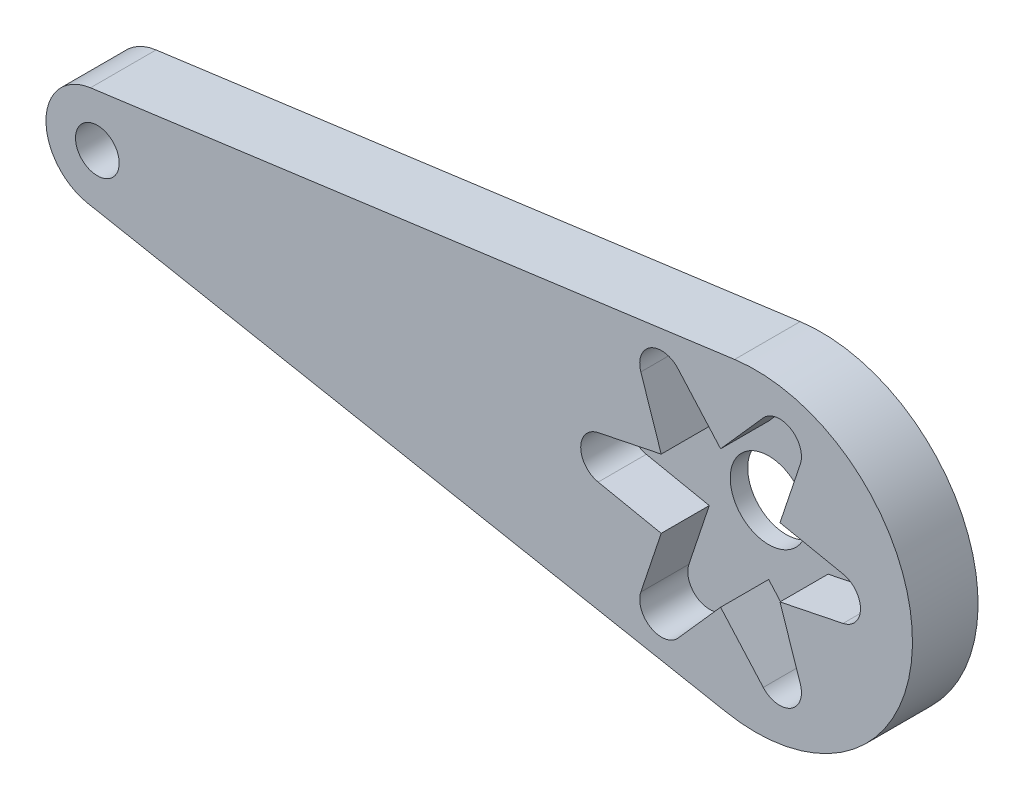
ISO-10303-21;
HEADER;
FILE_DESCRIPTION(('STEP AP214'),'2;1');
FILE_NAME('part.step','',(''),(''),'','','');
FILE_SCHEMA(('AUTOMOTIVE_DESIGN { 1 0 10303 214 1 1 1 1 }'));
ENDSEC;
DATA;
#1=APPLICATION_CONTEXT('core data for automotive mechanical design processes');
#2=APPLICATION_PROTOCOL_DEFINITION('international standard','automotive_design',2000,#1);
#3=PRODUCT_CONTEXT('',#1,'mechanical');
#4=PRODUCT('Part','Part','',(#3));
#5=PRODUCT_RELATED_PRODUCT_CATEGORY('part','',(#4));
#6=PRODUCT_DEFINITION_FORMATION('','',#4);
#7=PRODUCT_DEFINITION_CONTEXT('part definition',#1,'design');
#8=PRODUCT_DEFINITION('design','',#6,#7);
#9=PRODUCT_DEFINITION_SHAPE('','',#8);
#10=(LENGTH_UNIT() NAMED_UNIT(*) SI_UNIT(.MILLI.,.METRE.));
#11=(NAMED_UNIT(*) PLANE_ANGLE_UNIT() SI_UNIT($,.RADIAN.));
#12=(NAMED_UNIT(*) SI_UNIT($,.STERADIAN.) SOLID_ANGLE_UNIT());
#13=UNCERTAINTY_MEASURE_WITH_UNIT(LENGTH_MEASURE(1.E-05),#10,'distance_accuracy_value','');
#14=(GEOMETRIC_REPRESENTATION_CONTEXT(3) GLOBAL_UNCERTAINTY_ASSIGNED_CONTEXT((#13)) GLOBAL_UNIT_ASSIGNED_CONTEXT((#10,
#11,#12)) REPRESENTATION_CONTEXT('',''));
#15=CARTESIAN_POINT('',(0.,0.,0.));
#16=DIRECTION('',(0.,0.,1.));
#17=DIRECTION('',(1.,0.,0.));
#18=AXIS2_PLACEMENT_3D('',#15,#16,#17);
#19=CARTESIAN_POINT('',(5.87542804583031,-35.7470503145762,0.));
#20=DIRECTION('',(0.,0.,-1.));
#21=DIRECTION('',(-1.,0.,0.));
#22=AXIS2_PLACEMENT_3D('',#19,#20,#21);
#23=CYLINDRICAL_SURFACE('',#22,5.87542804583031);
#24=DIRECTION('',(0.,0.,-1.));
#25=VECTOR('',#24,1.);
#26=CARTESIAN_POINT('',(5.0907369305427,-29.9242576362029,7.5));
#27=LINE('',#26,#25);
#28=CARTESIAN_POINT('',(5.09073693054267,-29.9242576362029,0.));
#29=VERTEX_POINT('',#28);
#30=CARTESIAN_POINT('',(5.09073693054267,-29.9242576362029,7.5));
#31=VERTEX_POINT('',#30);
#32=EDGE_CURVE('E369',#29,#31,#27,.F.);
#33=ORIENTED_EDGE('',*,*,#32,.F.);
#34=CARTESIAN_POINT('',(5.87542804583031,-35.7470503145762,0.));
#35=DIRECTION('',(0.,0.,1.));
#36=DIRECTION('',(1.,0.,0.));
#37=AXIS2_PLACEMENT_3D('',#34,#35,#36);
#38=CIRCLE('',#37,5.87542804583031);
#39=CARTESIAN_POINT('',(4.77759431673095,-41.5190010961561,0.));
#40=VERTEX_POINT('',#39);
#41=EDGE_CURVE('E56',#40,#29,#38,.F.);
#42=ORIENTED_EDGE('',*,*,#41,.F.);
#43=DIRECTION('',(0.,0.,-1.));
#44=VECTOR('',#43,1.);
#45=CARTESIAN_POINT('',(4.77759431673095,-41.5190010961561,7.5));
#46=LINE('',#45,#44);
#47=CARTESIAN_POINT('',(4.77759431673095,-41.5190010961561,7.5));
#48=VERTEX_POINT('',#47);
#49=EDGE_CURVE('E372',#48,#40,#46,.T.);
#50=ORIENTED_EDGE('',*,*,#49,.F.);
#51=CARTESIAN_POINT('',(5.87542804583031,-35.7470503145762,7.5));
#52=DIRECTION('',(0.,0.,1.));
#53=DIRECTION('',(1.,0.,0.));
#54=AXIS2_PLACEMENT_3D('',#51,#52,#53);
#55=CIRCLE('',#54,5.87542804583031);
#56=EDGE_CURVE('E12',#31,#48,#55,.T.);
#57=ORIENTED_EDGE('',*,*,#56,.F.);
#58=EDGE_LOOP('',(#33,#42,#50,#57));
#59=FACE_BOUND('',#58,.T.);
#60=ADVANCED_FACE('F47',(#59),#23,.T.);
#61=CARTESIAN_POINT('',(81.1592148988789,-37.7802614739461,7.5));
#62=DIRECTION('',(0.,0.,-1.));
#63=DIRECTION('',(-1.,0.,0.));
#64=AXIS2_PLACEMENT_3D('',#61,#62,#63);
#65=CYLINDRICAL_SURFACE('',#64,17.9449292239593);
#66=DIRECTION('',(0.,0.,-1.));
#67=VECTOR('',#66,1.);
#68=CARTESIAN_POINT('',(78.7625849994626,-19.9960929530922,7.5));
#69=LINE('',#68,#67);
#70=CARTESIAN_POINT('',(78.7625849994626,-19.9960929530922,7.5));
#71=VERTEX_POINT('',#70);
#72=CARTESIAN_POINT('',(78.7625849994626,-19.9960929530922,0.));
#73=VERTEX_POINT('',#72);
#74=EDGE_CURVE('E355',#71,#73,#69,.T.);
#75=ORIENTED_EDGE('',*,*,#74,.F.);
#76=CARTESIAN_POINT('',(81.1592148988789,-37.7802614739461,7.5));
#77=DIRECTION('',(0.,0.,1.));
#78=DIRECTION('',(1.,0.,0.));
#79=AXIS2_PLACEMENT_3D('',#76,#77,#78);
#80=CIRCLE('',#79,17.9449292239593);
#81=CARTESIAN_POINT('',(77.8061743349077,-55.4091469698949,7.5));
#82=VERTEX_POINT('',#81);
#83=EDGE_CURVE('E364',#82,#71,#80,.T.);
#84=ORIENTED_EDGE('',*,*,#83,.F.);
#85=DIRECTION('',(0.,0.,-1.));
#86=VECTOR('',#85,1.);
#87=CARTESIAN_POINT('',(77.8061743349077,-55.4091469698949,7.5));
#88=LINE('',#87,#86);
#89=CARTESIAN_POINT('',(77.8061743349077,-55.4091469698949,0.));
#90=VERTEX_POINT('',#89);
#91=EDGE_CURVE('E361',#90,#82,#88,.F.);
#92=ORIENTED_EDGE('',*,*,#91,.F.);
#93=CARTESIAN_POINT('',(81.1592148988789,-37.7802614739461,0.));
#94=DIRECTION('',(0.,0.,1.));
#95=DIRECTION('',(1.,0.,0.));
#96=AXIS2_PLACEMENT_3D('',#93,#94,#95);
#97=CIRCLE('',#96,17.9449292239593);
#98=EDGE_CURVE('E366',#73,#90,#97,.F.);
#99=ORIENTED_EDGE('',*,*,#98,.F.);
#100=EDGE_LOOP('',(#75,#84,#92,#99));
#101=FACE_BOUND('',#100,.T.);
#102=ADVANCED_FACE('F410',(#101),#65,.T.);
#103=CARTESIAN_POINT('',(99.1041441228382,-17.2548240127613,7.5));
#104=DIRECTION('',(0.133554714510462,-0.991041441228382,0.));
#105=DIRECTION('',(0.991041441228382,0.133554714510462,0.));
#106=AXIS2_PLACEMENT_3D('',#103,#104,#105);
#107=PLANE('',#106);
#108=DIRECTION('',(-0.991041441228382,-0.133554714510462,0.));
#109=VECTOR('',#108,1.);
#110=CARTESIAN_POINT('',(99.1041441228382,-17.2548240127613,0.));
#111=LINE('',#110,#109);
#112=EDGE_CURVE('E318',#73,#29,#111,.T.);
#113=ORIENTED_EDGE('',*,*,#112,.T.);
#114=ORIENTED_EDGE('',*,*,#32,.T.);
#115=DIRECTION('',(-0.991041441228382,-0.133554714510462,0.));
#116=VECTOR('',#115,1.);
#117=CARTESIAN_POINT('',(99.1041441228382,-17.2548240127613,7.5));
#118=LINE('',#117,#116);
#119=EDGE_CURVE('E350',#71,#31,#118,.T.);
#120=ORIENTED_EDGE('',*,*,#119,.F.);
#121=ORIENTED_EDGE('',*,*,#74,.T.);
#122=EDGE_LOOP('',(#113,#114,#120,#121));
#123=FACE_BOUND('',#122,.T.);
#124=ADVANCED_FACE('F401',(#123),#107,.F.);
#125=CARTESIAN_POINT('',(0.,-40.6102954638075,7.5));
#126=DIRECTION('',(0.186851701788514,0.982388131818955,0.));
#127=DIRECTION('',(-0.982388131818955,0.186851701788514,0.));
#128=AXIS2_PLACEMENT_3D('',#125,#126,#127);
#129=PLANE('',#128);
#130=DIRECTION('',(0.982388131818955,-0.186851701788514,0.));
#131=VECTOR('',#130,1.);
#132=CARTESIAN_POINT('',(0.,-40.6102954638075,7.5));
#133=LINE('',#132,#131);
#134=EDGE_CURVE('E352',#48,#82,#133,.T.);
#135=ORIENTED_EDGE('',*,*,#134,.F.);
#136=ORIENTED_EDGE('',*,*,#49,.T.);
#137=DIRECTION('',(0.982388131818955,-0.186851701788514,0.));
#138=VECTOR('',#137,1.);
#139=CARTESIAN_POINT('',(0.,-40.6102954638075,0.));
#140=LINE('',#139,#138);
#141=EDGE_CURVE('E353',#40,#90,#140,.T.);
#142=ORIENTED_EDGE('',*,*,#141,.T.);
#143=ORIENTED_EDGE('',*,*,#91,.T.);
#144=EDGE_LOOP('',(#135,#136,#142,#143));
#145=FACE_BOUND('',#144,.T.);
#146=ADVANCED_FACE('F394',(#145),#129,.F.);
#147=CARTESIAN_POINT('',(0.,0.,7.5));
#148=DIRECTION('',(0.,0.,1.));
#149=DIRECTION('',(1.,0.,0.));
#150=AXIS2_PLACEMENT_3D('',#147,#148,#149);
#151=PLANE('',#150);
#152=CARTESIAN_POINT('',(5.87542804583031,-35.7470503145762,7.5));
#153=DIRECTION('',(0.,0.,1.));
#154=DIRECTION('',(1.,0.,0.));
#155=AXIS2_PLACEMENT_3D('',#152,#153,#154);
#156=CIRCLE('',#155,2.5);
#157=CARTESIAN_POINT('',(8.37542804583031,-35.7470503145762,7.5));
#158=VERTEX_POINT('',#157);
#159=EDGE_CURVE('E381',#158,#158,#156,.T.);
#160=ORIENTED_EDGE('',*,*,#159,.F.);
#161=EDGE_LOOP('',(#160));
#162=FACE_BOUND('',#161,.T.);
#163=DIRECTION('',(-0.979741032851596,-0.200268591014387,0.));
#164=VECTOR('',#163,1.);
#165=CARTESIAN_POINT('',(70.363905336225,-33.5726475279822,7.5));
#166=LINE('',#165,#164);
#167=CARTESIAN_POINT('',(70.363905336225,-33.5726475279822,7.5));
#168=VERTEX_POINT('',#167);
#169=CARTESIAN_POINT('',(63.1571680560339,-35.045774683547,7.5));
#170=VERTEX_POINT('',#169);
#171=EDGE_CURVE('E64',#168,#170,#166,.T.);
#172=ORIENTED_EDGE('',*,*,#171,.F.);
#173=DIRECTION('',(0.316432829027213,-0.948614919086683,0.));
#174=VECTOR('',#173,1.);
#175=CARTESIAN_POINT('',(70.363905336225,-33.5726475279822,7.5));
#176=LINE('',#175,#174);
#177=CARTESIAN_POINT('',(68.0363022358533,-26.594866387154,7.5));
#178=VERTEX_POINT('',#177);
#179=EDGE_CURVE('E217',#178,#168,#176,.T.);
#180=ORIENTED_EDGE('',*,*,#179,.F.);
#181=CARTESIAN_POINT('',(70.40783953357,-25.803784314586,7.5));
#182=DIRECTION('',(0.,0.,1.));
#183=DIRECTION('',(-1.,0.,0.));
#184=AXIS2_PLACEMENT_3D('',#181,#182,#183);
#185=CIRCLE('',#184,2.5);
#186=CARTESIAN_POINT('',(72.2787053537508,-24.1455138050251,7.5));
#187=VERTEX_POINT('',#186);
#188=EDGE_CURVE('E220',#187,#178,#185,.T.);
#189=ORIENTED_EDGE('',*,*,#188,.F.);
#190=DIRECTION('',(-0.663308203824365,0.7483463280723,0.));
#191=VECTOR('',#190,1.);
#192=CARTESIAN_POINT('',(77.15783953357,-29.6501677902885,7.5));
#193=LINE('',#192,#191);
#194=CARTESIAN_POINT('',(77.15783953357,-29.6501677902885,7.5));
#195=VERTEX_POINT('',#194);
#196=EDGE_CURVE('E311',#195,#187,#193,.T.);
#197=ORIENTED_EDGE('',*,*,#196,.F.);
#198=DIRECTION('',(-0.663308203824383,-0.748346328072284,0.));
#199=VECTOR('',#198,1.);
#200=CARTESIAN_POINT('',(82.0369737133893,-24.1455138050251,7.5));
#201=LINE('',#200,#199);
#202=CARTESIAN_POINT('',(82.0369737133893,-24.1455138050251,7.5));
#203=VERTEX_POINT('',#202);
#204=EDGE_CURVE('E308',#203,#195,#201,.T.);
#205=ORIENTED_EDGE('',*,*,#204,.F.);
#206=CARTESIAN_POINT('',(83.90783953357,-25.8037843145861,7.5));
#207=DIRECTION('',(0.,0.,1.));
#208=DIRECTION('',(-1.,0.,0.));
#209=AXIS2_PLACEMENT_3D('',#206,#207,#208);
#210=CIRCLE('',#209,2.5);
#211=CARTESIAN_POINT('',(86.2793768312867,-26.5948663871542,7.5));
#212=VERTEX_POINT('',#211);
#213=EDGE_CURVE('E305',#212,#203,#210,.T.);
#214=ORIENTED_EDGE('',*,*,#213,.F.);
#215=DIRECTION('',(0.316432829027233,0.948614919086677,0.));
#216=VECTOR('',#215,1.);
#217=CARTESIAN_POINT('',(83.9517737309149,-33.5726475279822,7.5));
#218=LINE('',#217,#216);
#219=CARTESIAN_POINT('',(83.9517737309149,-33.5726475279822,7.5));
#220=VERTEX_POINT('',#219);
#221=EDGE_CURVE('E302',#220,#212,#218,.T.);
#222=ORIENTED_EDGE('',*,*,#221,.F.);
#223=DIRECTION('',(-0.979741032851596,0.200268591014388,0.));
#224=VECTOR('',#223,1.);
#225=CARTESIAN_POINT('',(91.1585110111059,-35.045774683547,7.5));
#226=LINE('',#225,#224);
#227=CARTESIAN_POINT('',(91.1585110111059,-35.045774683547,7.5));
#228=VERTEX_POINT('',#227);
#229=EDGE_CURVE('E299',#228,#220,#226,.T.);
#230=ORIENTED_EDGE('',*,*,#229,.F.);
#231=CARTESIAN_POINT('',(90.6578395335699,-37.4951272656759,7.5));
#232=DIRECTION('',(0.,0.,1.));
#233=DIRECTION('',(-1.,0.,0.));
#234=AXIS2_PLACEMENT_3D('',#231,#232,#233);
#235=CIRCLE('',#234,2.5);
#236=CARTESIAN_POINT('',(91.1585110111059,-39.9444798478049,7.5));
#237=VERTEX_POINT('',#236);
#238=EDGE_CURVE('E296',#237,#228,#235,.T.);
#239=ORIENTED_EDGE('',*,*,#238,.F.);
#240=DIRECTION('',(0.979741032851596,0.200268591014388,0.));
#241=VECTOR('',#240,1.);
#242=CARTESIAN_POINT('',(83.9517737309148,-41.4176070033697,7.5));
#243=LINE('',#242,#241);
#244=CARTESIAN_POINT('',(83.9517737309148,-41.4176070033697,7.5));
#245=VERTEX_POINT('',#244);
#246=EDGE_CURVE('E293',#245,#237,#243,.T.);
#247=ORIENTED_EDGE('',*,*,#246,.F.);
#248=DIRECTION('',(-0.316432829027219,0.948614919086681,0.));
#249=VECTOR('',#248,1.);
#250=CARTESIAN_POINT('',(86.2793768312866,-48.3953881441978,7.5));
#251=LINE('',#250,#249);
#252=CARTESIAN_POINT('',(86.2793768312866,-48.3953881441978,7.5));
#253=VERTEX_POINT('',#252);
#254=EDGE_CURVE('E290',#253,#245,#251,.T.);
#255=ORIENTED_EDGE('',*,*,#254,.F.);
#256=CARTESIAN_POINT('',(83.9078395335699,-49.1864702167659,7.5));
#257=DIRECTION('',(0.,0.,1.));
#258=DIRECTION('',(1.,0.,0.));
#259=AXIS2_PLACEMENT_3D('',#256,#257,#258);
#260=CIRCLE('',#259,2.5);
#261=CARTESIAN_POINT('',(82.0369737133891,-50.8447407263268,7.5));
#262=VERTEX_POINT('',#261);
#263=EDGE_CURVE('E287',#262,#253,#260,.T.);
#264=ORIENTED_EDGE('',*,*,#263,.F.);
#265=DIRECTION('',(0.663308203824373,-0.748346328072293,0.));
#266=VECTOR('',#265,1.);
#267=CARTESIAN_POINT('',(77.1578395335699,-45.3400867410634,7.5));
#268=LINE('',#267,#266);
#269=CARTESIAN_POINT('',(77.1578395335699,-45.3400867410634,7.5));
#270=VERTEX_POINT('',#269);
#271=EDGE_CURVE('E284',#270,#262,#268,.T.);
#272=ORIENTED_EDGE('',*,*,#271,.F.);
#273=DIRECTION('',(0.663308203824378,0.748346328072289,0.));
#274=VECTOR('',#273,1.);
#275=CARTESIAN_POINT('',(72.2787053537506,-50.8447407263268,7.5));
#276=LINE('',#275,#274);
#277=CARTESIAN_POINT('',(72.2787053537506,-50.8447407263268,7.5));
#278=VERTEX_POINT('',#277);
#279=EDGE_CURVE('E281',#278,#270,#276,.T.);
#280=ORIENTED_EDGE('',*,*,#279,.F.);
#281=CARTESIAN_POINT('',(70.4078395335698,-49.1864702167658,7.5));
#282=DIRECTION('',(0.,0.,1.));
#283=DIRECTION('',(1.,0.,0.));
#284=AXIS2_PLACEMENT_3D('',#281,#282,#283);
#285=CIRCLE('',#284,2.5);
#286=CARTESIAN_POINT('',(68.0363022358531,-48.3953881441978,7.5));
#287=VERTEX_POINT('',#286);
#288=EDGE_CURVE('E278',#287,#278,#285,.T.);
#289=ORIENTED_EDGE('',*,*,#288,.F.);
#290=DIRECTION('',(-0.316432829027226,-0.948614919086679,0.));
#291=VECTOR('',#290,1.);
#292=CARTESIAN_POINT('',(70.3639053362249,-41.4176070033697,7.5));
#293=LINE('',#292,#291);
#294=CARTESIAN_POINT('',(70.3639053362249,-41.4176070033697,7.5));
#295=VERTEX_POINT('',#294);
#296=EDGE_CURVE('E275',#295,#287,#293,.T.);
#297=ORIENTED_EDGE('',*,*,#296,.F.);
#298=DIRECTION('',(0.979741032851596,-0.200268591014388,0.));
#299=VECTOR('',#298,1.);
#300=CARTESIAN_POINT('',(70.3639053362249,-41.4176070033697,7.5));
#301=LINE('',#300,#299);
#302=CARTESIAN_POINT('',(63.1571680560339,-39.9444798478049,7.5));
#303=VERTEX_POINT('',#302);
#304=EDGE_CURVE('E272',#303,#295,#301,.T.);
#305=ORIENTED_EDGE('',*,*,#304,.F.);
#306=CARTESIAN_POINT('',(63.6578395335699,-37.4951272656759,7.5));
#307=DIRECTION('',(0.,0.,1.));
#308=DIRECTION('',(1.,0.,0.));
#309=AXIS2_PLACEMENT_3D('',#306,#307,#308);
#310=CIRCLE('',#309,2.5);
#311=EDGE_CURVE('E270',#170,#303,#310,.T.);
#312=ORIENTED_EDGE('',*,*,#311,.F.);
#313=EDGE_LOOP('',(#172,#180,#189,#197,#205,#214,#222,#230,#239,#247,#255,#264,#272,#280,#289,
#297,#305,#312));
#314=FACE_BOUND('',#313,.T.);
#315=ORIENTED_EDGE('',*,*,#119,.T.);
#316=ORIENTED_EDGE('',*,*,#56,.T.);
#317=ORIENTED_EDGE('',*,*,#134,.T.);
#318=ORIENTED_EDGE('',*,*,#83,.T.);
#319=EDGE_LOOP('',(#315,#316,#317,#318));
#320=FACE_BOUND('',#319,.T.);
#321=ADVANCED_FACE('F390',(#162,#314,#320),#151,.T.);
#322=CARTESIAN_POINT('',(0.,0.,0.));
#323=DIRECTION('',(0.,0.,1.));
#324=DIRECTION('',(1.,0.,0.));
#325=AXIS2_PLACEMENT_3D('',#322,#323,#324);
#326=PLANE('',#325);
#327=CARTESIAN_POINT('',(5.87542804583031,-35.7470503145762,0.));
#328=DIRECTION('',(0.,0.,1.));
#329=DIRECTION('',(1.,0.,0.));
#330=AXIS2_PLACEMENT_3D('',#327,#328,#329);
#331=CIRCLE('',#330,2.5);
#332=CARTESIAN_POINT('',(8.37542804583031,-35.7470503145762,0.));
#333=VERTEX_POINT('',#332);
#334=EDGE_CURVE('E51',#333,#333,#331,.T.);
#335=ORIENTED_EDGE('',*,*,#334,.T.);
#336=EDGE_LOOP('',(#335));
#337=FACE_BOUND('',#336,.T.);
#338=CARTESIAN_POINT('',(77.1578395335699,-37.4951272656759,0.));
#339=DIRECTION('',(0.,0.,1.));
#340=DIRECTION('',(1.,0.,0.));
#341=AXIS2_PLACEMENT_3D('',#338,#339,#340);
#342=CIRCLE('',#341,4.4);
#343=CARTESIAN_POINT('',(81.5578395335699,-37.4951272656759,0.));
#344=VERTEX_POINT('',#343);
#345=EDGE_CURVE('E223',#344,#344,#342,.T.);
#346=ORIENTED_EDGE('',*,*,#345,.T.);
#347=EDGE_LOOP('',(#346));
#348=FACE_BOUND('',#347,.T.);
#349=ORIENTED_EDGE('',*,*,#141,.F.);
#350=ORIENTED_EDGE('',*,*,#41,.T.);
#351=ORIENTED_EDGE('',*,*,#112,.F.);
#352=ORIENTED_EDGE('',*,*,#98,.T.);
#353=EDGE_LOOP('',(#349,#350,#351,#352));
#354=FACE_BOUND('',#353,.T.);
#355=ADVANCED_FACE('F393',(#337,#348,#354),#326,.F.);
#356=CARTESIAN_POINT('',(70.363905336225,-33.5726475279822,2.));
#357=DIRECTION('',(-0.200268591014387,0.979741032851596,0.));
#358=DIRECTION('',(-0.979741032851596,-0.200268591014387,0.));
#359=AXIS2_PLACEMENT_3D('',#356,#357,#358);
#360=PLANE('',#359);
#361=ORIENTED_EDGE('',*,*,#171,.T.);
#362=DIRECTION('',(0.,0.,1.));
#363=VECTOR('',#362,1.);
#364=CARTESIAN_POINT('',(63.1571680560339,-35.045774683547,2.));
#365=LINE('',#364,#363);
#366=CARTESIAN_POINT('',(63.1571680560339,-35.045774683547,2.));
#367=VERTEX_POINT('',#366);
#368=EDGE_CURVE('E194',#367,#170,#365,.T.);
#369=ORIENTED_EDGE('',*,*,#368,.F.);
#370=DIRECTION('',(-0.979741032851596,-0.200268591014387,0.));
#371=VECTOR('',#370,1.);
#372=CARTESIAN_POINT('',(70.363905336225,-33.5726475279822,2.));
#373=LINE('',#372,#371);
#374=CARTESIAN_POINT('',(70.363905336225,-33.5726475279822,2.));
#375=VERTEX_POINT('',#374);
#376=EDGE_CURVE('E198',#375,#367,#373,.T.);
#377=ORIENTED_EDGE('',*,*,#376,.F.);
#378=DIRECTION('',(0.,0.,1.));
#379=VECTOR('',#378,1.);
#380=CARTESIAN_POINT('',(70.363905336225,-33.5726475279822,2.));
#381=LINE('',#380,#379);
#382=EDGE_CURVE('E316',#375,#168,#381,.T.);
#383=ORIENTED_EDGE('',*,*,#382,.T.);
#384=EDGE_LOOP('',(#361,#369,#377,#383));
#385=FACE_BOUND('',#384,.T.);
#386=ADVANCED_FACE('F196',(#385),#360,.F.);
#387=CARTESIAN_POINT('',(70.363905336225,-33.5726475279822,2.));
#388=DIRECTION('',(-0.948614919086683,-0.316432829027213,0.));
#389=DIRECTION('',(0.316432829027213,-0.948614919086683,0.));
#390=AXIS2_PLACEMENT_3D('',#387,#388,#389);
#391=PLANE('',#390);
#392=ORIENTED_EDGE('',*,*,#179,.T.);
#393=ORIENTED_EDGE('',*,*,#382,.F.);
#394=DIRECTION('',(0.316432829027213,-0.948614919086683,0.));
#395=VECTOR('',#394,1.);
#396=CARTESIAN_POINT('',(70.363905336225,-33.5726475279822,2.));
#397=LINE('',#396,#395);
#398=CARTESIAN_POINT('',(68.0363022358533,-26.594866387154,2.));
#399=VERTEX_POINT('',#398);
#400=EDGE_CURVE('E204',#399,#375,#397,.T.);
#401=ORIENTED_EDGE('',*,*,#400,.F.);
#402=DIRECTION('',(0.,0.,1.));
#403=VECTOR('',#402,1.);
#404=CARTESIAN_POINT('',(68.0363022358533,-26.594866387154,2.));
#405=LINE('',#404,#403);
#406=EDGE_CURVE('E319',#399,#178,#405,.T.);
#407=ORIENTED_EDGE('',*,*,#406,.T.);
#408=EDGE_LOOP('',(#392,#393,#401,#407));
#409=FACE_BOUND('',#408,.T.);
#410=ADVANCED_FACE('F418',(#409),#391,.F.);
#411=CARTESIAN_POINT('',(70.40783953357,-25.803784314586,2.));
#412=DIRECTION('',(0.,0.,1.));
#413=DIRECTION('',(1.,0.,0.));
#414=AXIS2_PLACEMENT_3D('',#411,#412,#413);
#415=CYLINDRICAL_SURFACE('',#414,2.5);
#416=ORIENTED_EDGE('',*,*,#188,.T.);
#417=ORIENTED_EDGE('',*,*,#406,.F.);
#418=CARTESIAN_POINT('',(70.40783953357,-25.803784314586,2.));
#419=DIRECTION('',(0.,0.,1.));
#420=DIRECTION('',(-1.,0.,0.));
#421=AXIS2_PLACEMENT_3D('',#418,#419,#420);
#422=CIRCLE('',#421,2.5);
#423=CARTESIAN_POINT('',(72.2787053537508,-24.1455138050251,2.));
#424=VERTEX_POINT('',#423);
#425=EDGE_CURVE('E266',#424,#399,#422,.T.);
#426=ORIENTED_EDGE('',*,*,#425,.F.);
#427=DIRECTION('',(0.,0.,1.));
#428=VECTOR('',#427,1.);
#429=CARTESIAN_POINT('',(72.2787053537508,-24.1455138050251,2.));
#430=LINE('',#429,#428);
#431=EDGE_CURVE('E321',#424,#187,#430,.T.);
#432=ORIENTED_EDGE('',*,*,#431,.T.);
#433=EDGE_LOOP('',(#416,#417,#426,#432));
#434=FACE_BOUND('',#433,.T.);
#435=ADVANCED_FACE('F451',(#434),#415,.F.);
#436=CARTESIAN_POINT('',(77.15783953357,-29.6501677902885,2.));
#437=DIRECTION('',(0.7483463280723,0.663308203824365,0.));
#438=DIRECTION('',(-0.663308203824365,0.7483463280723,0.));
#439=AXIS2_PLACEMENT_3D('',#436,#437,#438);
#440=PLANE('',#439);
#441=ORIENTED_EDGE('',*,*,#196,.T.);
#442=ORIENTED_EDGE('',*,*,#431,.F.);
#443=DIRECTION('',(-0.663308203824365,0.7483463280723,0.));
#444=VECTOR('',#443,1.);
#445=CARTESIAN_POINT('',(77.15783953357,-29.6501677902885,2.));
#446=LINE('',#445,#444);
#447=CARTESIAN_POINT('',(77.15783953357,-29.6501677902885,2.));
#448=VERTEX_POINT('',#447);
#449=EDGE_CURVE('E263',#448,#424,#446,.T.);
#450=ORIENTED_EDGE('',*,*,#449,.F.);
#451=DIRECTION('',(0.,0.,1.));
#452=VECTOR('',#451,1.);
#453=CARTESIAN_POINT('',(77.15783953357,-29.6501677902885,2.));
#454=LINE('',#453,#452);
#455=EDGE_CURVE('E323',#448,#195,#454,.T.);
#456=ORIENTED_EDGE('',*,*,#455,.T.);
#457=EDGE_LOOP('',(#441,#442,#450,#456));
#458=FACE_BOUND('',#457,.T.);
#459=ADVANCED_FACE('F460',(#458),#440,.F.);
#460=CARTESIAN_POINT('',(82.0369737133893,-24.1455138050251,2.));
#461=DIRECTION('',(-0.748346328072284,0.663308203824383,0.));
#462=DIRECTION('',(-0.663308203824383,-0.748346328072284,0.));
#463=AXIS2_PLACEMENT_3D('',#460,#461,#462);
#464=PLANE('',#463);
#465=ORIENTED_EDGE('',*,*,#204,.T.);
#466=ORIENTED_EDGE('',*,*,#455,.F.);
#467=DIRECTION('',(-0.663308203824383,-0.748346328072284,0.));
#468=VECTOR('',#467,1.);
#469=CARTESIAN_POINT('',(82.0369737133893,-24.1455138050251,2.));
#470=LINE('',#469,#468);
#471=CARTESIAN_POINT('',(82.0369737133893,-24.1455138050251,2.));
#472=VERTEX_POINT('',#471);
#473=EDGE_CURVE('E260',#472,#448,#470,.T.);
#474=ORIENTED_EDGE('',*,*,#473,.F.);
#475=DIRECTION('',(0.,0.,1.));
#476=VECTOR('',#475,1.);
#477=CARTESIAN_POINT('',(82.0369737133893,-24.1455138050251,2.));
#478=LINE('',#477,#476);
#479=EDGE_CURVE('E325',#472,#203,#478,.T.);
#480=ORIENTED_EDGE('',*,*,#479,.T.);
#481=EDGE_LOOP('',(#465,#466,#474,#480));
#482=FACE_BOUND('',#481,.T.);
#483=ADVANCED_FACE('F469',(#482),#464,.F.);
#484=CARTESIAN_POINT('',(83.90783953357,-25.8037843145861,2.));
#485=DIRECTION('',(0.,0.,1.));
#486=DIRECTION('',(1.,0.,0.));
#487=AXIS2_PLACEMENT_3D('',#484,#485,#486);
#488=CYLINDRICAL_SURFACE('',#487,2.5);
#489=ORIENTED_EDGE('',*,*,#213,.T.);
#490=ORIENTED_EDGE('',*,*,#479,.F.);
#491=CARTESIAN_POINT('',(83.90783953357,-25.8037843145861,2.));
#492=DIRECTION('',(0.,0.,1.));
#493=DIRECTION('',(-1.,0.,0.));
#494=AXIS2_PLACEMENT_3D('',#491,#492,#493);
#495=CIRCLE('',#494,2.5);
#496=CARTESIAN_POINT('',(86.2793768312867,-26.5948663871542,2.));
#497=VERTEX_POINT('',#496);
#498=EDGE_CURVE('E257',#497,#472,#495,.T.);
#499=ORIENTED_EDGE('',*,*,#498,.F.);
#500=DIRECTION('',(0.,0.,1.));
#501=VECTOR('',#500,1.);
#502=CARTESIAN_POINT('',(86.2793768312867,-26.5948663871542,2.));
#503=LINE('',#502,#501);
#504=EDGE_CURVE('E327',#497,#212,#503,.T.);
#505=ORIENTED_EDGE('',*,*,#504,.T.);
#506=EDGE_LOOP('',(#489,#490,#499,#505));
#507=FACE_BOUND('',#506,.T.);
#508=ADVANCED_FACE('F478',(#507),#488,.F.);
#509=CARTESIAN_POINT('',(83.9517737309149,-33.5726475279822,2.));
#510=DIRECTION('',(0.948614919086677,-0.316432829027233,0.));
#511=DIRECTION('',(0.316432829027233,0.948614919086677,0.));
#512=AXIS2_PLACEMENT_3D('',#509,#510,#511);
#513=PLANE('',#512);
#514=ORIENTED_EDGE('',*,*,#221,.T.);
#515=ORIENTED_EDGE('',*,*,#504,.F.);
#516=DIRECTION('',(0.316432829027233,0.948614919086677,0.));
#517=VECTOR('',#516,1.);
#518=CARTESIAN_POINT('',(83.9517737309149,-33.5726475279822,2.));
#519=LINE('',#518,#517);
#520=CARTESIAN_POINT('',(83.9517737309149,-33.5726475279822,2.));
#521=VERTEX_POINT('',#520);
#522=EDGE_CURVE('E254',#521,#497,#519,.T.);
#523=ORIENTED_EDGE('',*,*,#522,.F.);
#524=DIRECTION('',(0.,0.,1.));
#525=VECTOR('',#524,1.);
#526=CARTESIAN_POINT('',(83.9517737309149,-33.5726475279822,2.));
#527=LINE('',#526,#525);
#528=EDGE_CURVE('E329',#521,#220,#527,.T.);
#529=ORIENTED_EDGE('',*,*,#528,.T.);
#530=EDGE_LOOP('',(#514,#515,#523,#529));
#531=FACE_BOUND('',#530,.T.);
#532=ADVANCED_FACE('F487',(#531),#513,.F.);
#533=CARTESIAN_POINT('',(91.1585110111059,-35.045774683547,2.));
#534=DIRECTION('',(0.200268591014388,0.979741032851596,0.));
#535=DIRECTION('',(-0.979741032851596,0.200268591014388,0.));
#536=AXIS2_PLACEMENT_3D('',#533,#534,#535);
#537=PLANE('',#536);
#538=ORIENTED_EDGE('',*,*,#229,.T.);
#539=ORIENTED_EDGE('',*,*,#528,.F.);
#540=DIRECTION('',(-0.979741032851596,0.200268591014388,0.));
#541=VECTOR('',#540,1.);
#542=CARTESIAN_POINT('',(91.1585110111059,-35.045774683547,2.));
#543=LINE('',#542,#541);
#544=CARTESIAN_POINT('',(91.1585110111059,-35.045774683547,2.));
#545=VERTEX_POINT('',#544);
#546=EDGE_CURVE('E251',#545,#521,#543,.T.);
#547=ORIENTED_EDGE('',*,*,#546,.F.);
#548=DIRECTION('',(0.,0.,1.));
#549=VECTOR('',#548,1.);
#550=CARTESIAN_POINT('',(91.1585110111059,-35.045774683547,2.));
#551=LINE('',#550,#549);
#552=EDGE_CURVE('E331',#545,#228,#551,.T.);
#553=ORIENTED_EDGE('',*,*,#552,.T.);
#554=EDGE_LOOP('',(#538,#539,#547,#553));
#555=FACE_BOUND('',#554,.T.);
#556=ADVANCED_FACE('F496',(#555),#537,.F.);
#557=CARTESIAN_POINT('',(90.6578395335699,-37.4951272656759,2.));
#558=DIRECTION('',(0.,0.,1.));
#559=DIRECTION('',(1.,0.,0.));
#560=AXIS2_PLACEMENT_3D('',#557,#558,#559);
#561=CYLINDRICAL_SURFACE('',#560,2.5);
#562=ORIENTED_EDGE('',*,*,#238,.T.);
#563=ORIENTED_EDGE('',*,*,#552,.F.);
#564=CARTESIAN_POINT('',(90.6578395335699,-37.4951272656759,2.));
#565=DIRECTION('',(0.,0.,1.));
#566=DIRECTION('',(-1.,0.,0.));
#567=AXIS2_PLACEMENT_3D('',#564,#565,#566);
#568=CIRCLE('',#567,2.5);
#569=CARTESIAN_POINT('',(91.1585110111059,-39.9444798478049,2.));
#570=VERTEX_POINT('',#569);
#571=EDGE_CURVE('E248',#570,#545,#568,.T.);
#572=ORIENTED_EDGE('',*,*,#571,.F.);
#573=DIRECTION('',(0.,0.,1.));
#574=VECTOR('',#573,1.);
#575=CARTESIAN_POINT('',(91.1585110111059,-39.9444798478049,2.));
#576=LINE('',#575,#574);
#577=EDGE_CURVE('E333',#570,#237,#576,.T.);
#578=ORIENTED_EDGE('',*,*,#577,.T.);
#579=EDGE_LOOP('',(#562,#563,#572,#578));
#580=FACE_BOUND('',#579,.T.);
#581=ADVANCED_FACE('F505',(#580),#561,.F.);
#582=CARTESIAN_POINT('',(83.9517737309148,-41.4176070033697,2.));
#583=DIRECTION('',(0.200268591014388,-0.979741032851596,0.));
#584=DIRECTION('',(0.979741032851596,0.200268591014388,0.));
#585=AXIS2_PLACEMENT_3D('',#582,#583,#584);
#586=PLANE('',#585);
#587=ORIENTED_EDGE('',*,*,#246,.T.);
#588=ORIENTED_EDGE('',*,*,#577,.F.);
#589=DIRECTION('',(0.979741032851596,0.200268591014388,0.));
#590=VECTOR('',#589,1.);
#591=CARTESIAN_POINT('',(83.9517737309148,-41.4176070033697,2.));
#592=LINE('',#591,#590);
#593=CARTESIAN_POINT('',(83.9517737309148,-41.4176070033697,2.));
#594=VERTEX_POINT('',#593);
#595=EDGE_CURVE('E245',#594,#570,#592,.T.);
#596=ORIENTED_EDGE('',*,*,#595,.F.);
#597=DIRECTION('',(0.,0.,1.));
#598=VECTOR('',#597,1.);
#599=CARTESIAN_POINT('',(83.9517737309148,-41.4176070033697,2.));
#600=LINE('',#599,#598);
#601=EDGE_CURVE('E335',#594,#245,#600,.T.);
#602=ORIENTED_EDGE('',*,*,#601,.T.);
#603=EDGE_LOOP('',(#587,#588,#596,#602));
#604=FACE_BOUND('',#603,.T.);
#605=ADVANCED_FACE('F514',(#604),#586,.F.);
#606=CARTESIAN_POINT('',(86.2793768312866,-48.3953881441978,2.));
#607=DIRECTION('',(0.948614919086681,0.316432829027219,0.));
#608=DIRECTION('',(-0.316432829027219,0.948614919086681,0.));
#609=AXIS2_PLACEMENT_3D('',#606,#607,#608);
#610=PLANE('',#609);
#611=ORIENTED_EDGE('',*,*,#254,.T.);
#612=ORIENTED_EDGE('',*,*,#601,.F.);
#613=DIRECTION('',(-0.316432829027219,0.948614919086681,0.));
#614=VECTOR('',#613,1.);
#615=CARTESIAN_POINT('',(86.2793768312866,-48.3953881441978,2.));
#616=LINE('',#615,#614);
#617=CARTESIAN_POINT('',(86.2793768312866,-48.3953881441978,2.));
#618=VERTEX_POINT('',#617);
#619=EDGE_CURVE('E242',#618,#594,#616,.T.);
#620=ORIENTED_EDGE('',*,*,#619,.F.);
#621=DIRECTION('',(0.,0.,1.));
#622=VECTOR('',#621,1.);
#623=CARTESIAN_POINT('',(86.2793768312866,-48.3953881441978,2.));
#624=LINE('',#623,#622);
#625=EDGE_CURVE('E337',#618,#253,#624,.T.);
#626=ORIENTED_EDGE('',*,*,#625,.T.);
#627=EDGE_LOOP('',(#611,#612,#620,#626));
#628=FACE_BOUND('',#627,.T.);
#629=ADVANCED_FACE('F523',(#628),#610,.F.);
#630=CARTESIAN_POINT('',(83.9078395335699,-49.1864702167659,2.));
#631=DIRECTION('',(0.,0.,1.));
#632=DIRECTION('',(1.,0.,0.));
#633=AXIS2_PLACEMENT_3D('',#630,#631,#632);
#634=CYLINDRICAL_SURFACE('',#633,2.5);
#635=ORIENTED_EDGE('',*,*,#263,.T.);
#636=ORIENTED_EDGE('',*,*,#625,.F.);
#637=CARTESIAN_POINT('',(83.9078395335699,-49.1864702167659,2.));
#638=DIRECTION('',(0.,0.,1.));
#639=DIRECTION('',(1.,0.,0.));
#640=AXIS2_PLACEMENT_3D('',#637,#638,#639);
#641=CIRCLE('',#640,2.5);
#642=CARTESIAN_POINT('',(82.0369737133891,-50.8447407263268,2.));
#643=VERTEX_POINT('',#642);
#644=EDGE_CURVE('E239',#643,#618,#641,.T.);
#645=ORIENTED_EDGE('',*,*,#644,.F.);
#646=DIRECTION('',(0.,0.,1.));
#647=VECTOR('',#646,1.);
#648=CARTESIAN_POINT('',(82.0369737133891,-50.8447407263268,2.));
#649=LINE('',#648,#647);
#650=EDGE_CURVE('E339',#643,#262,#649,.T.);
#651=ORIENTED_EDGE('',*,*,#650,.T.);
#652=EDGE_LOOP('',(#635,#636,#645,#651));
#653=FACE_BOUND('',#652,.T.);
#654=ADVANCED_FACE('F532',(#653),#634,.F.);
#655=CARTESIAN_POINT('',(77.1578395335699,-45.3400867410634,2.));
#656=DIRECTION('',(-0.748346328072293,-0.663308203824373,0.));
#657=DIRECTION('',(0.663308203824373,-0.748346328072293,0.));
#658=AXIS2_PLACEMENT_3D('',#655,#656,#657);
#659=PLANE('',#658);
#660=ORIENTED_EDGE('',*,*,#271,.T.);
#661=ORIENTED_EDGE('',*,*,#650,.F.);
#662=DIRECTION('',(0.663308203824373,-0.748346328072293,0.));
#663=VECTOR('',#662,1.);
#664=CARTESIAN_POINT('',(77.1578395335699,-45.3400867410634,2.));
#665=LINE('',#664,#663);
#666=CARTESIAN_POINT('',(77.1578395335699,-45.3400867410634,2.));
#667=VERTEX_POINT('',#666);
#668=EDGE_CURVE('E236',#667,#643,#665,.T.);
#669=ORIENTED_EDGE('',*,*,#668,.F.);
#670=DIRECTION('',(0.,0.,1.));
#671=VECTOR('',#670,1.);
#672=CARTESIAN_POINT('',(77.1578395335699,-45.3400867410634,2.));
#673=LINE('',#672,#671);
#674=EDGE_CURVE('E341',#667,#270,#673,.T.);
#675=ORIENTED_EDGE('',*,*,#674,.T.);
#676=EDGE_LOOP('',(#660,#661,#669,#675));
#677=FACE_BOUND('',#676,.T.);
#678=ADVANCED_FACE('F541',(#677),#659,.F.);
#679=CARTESIAN_POINT('',(72.2787053537506,-50.8447407263268,2.));
#680=DIRECTION('',(0.748346328072289,-0.663308203824378,0.));
#681=DIRECTION('',(0.663308203824378,0.748346328072289,0.));
#682=AXIS2_PLACEMENT_3D('',#679,#680,#681);
#683=PLANE('',#682);
#684=ORIENTED_EDGE('',*,*,#279,.T.);
#685=ORIENTED_EDGE('',*,*,#674,.F.);
#686=DIRECTION('',(0.663308203824378,0.748346328072289,0.));
#687=VECTOR('',#686,1.);
#688=CARTESIAN_POINT('',(72.2787053537506,-50.8447407263268,2.));
#689=LINE('',#688,#687);
#690=CARTESIAN_POINT('',(72.2787053537506,-50.8447407263268,2.));
#691=VERTEX_POINT('',#690);
#692=EDGE_CURVE('E233',#691,#667,#689,.T.);
#693=ORIENTED_EDGE('',*,*,#692,.F.);
#694=DIRECTION('',(0.,0.,1.));
#695=VECTOR('',#694,1.);
#696=CARTESIAN_POINT('',(72.2787053537506,-50.8447407263268,2.));
#697=LINE('',#696,#695);
#698=EDGE_CURVE('E343',#691,#278,#697,.T.);
#699=ORIENTED_EDGE('',*,*,#698,.T.);
#700=EDGE_LOOP('',(#684,#685,#693,#699));
#701=FACE_BOUND('',#700,.T.);
#702=ADVANCED_FACE('F550',(#701),#683,.F.);
#703=CARTESIAN_POINT('',(70.4078395335698,-49.1864702167658,2.));
#704=DIRECTION('',(0.,0.,1.));
#705=DIRECTION('',(1.,0.,0.));
#706=AXIS2_PLACEMENT_3D('',#703,#704,#705);
#707=CYLINDRICAL_SURFACE('',#706,2.5);
#708=ORIENTED_EDGE('',*,*,#288,.T.);
#709=ORIENTED_EDGE('',*,*,#698,.F.);
#710=CARTESIAN_POINT('',(70.4078395335698,-49.1864702167658,2.));
#711=DIRECTION('',(0.,0.,1.));
#712=DIRECTION('',(1.,0.,0.));
#713=AXIS2_PLACEMENT_3D('',#710,#711,#712);
#714=CIRCLE('',#713,2.5);
#715=CARTESIAN_POINT('',(68.0363022358531,-48.3953881441978,2.));
#716=VERTEX_POINT('',#715);
#717=EDGE_CURVE('E230',#716,#691,#714,.T.);
#718=ORIENTED_EDGE('',*,*,#717,.F.);
#719=DIRECTION('',(0.,0.,1.));
#720=VECTOR('',#719,1.);
#721=CARTESIAN_POINT('',(68.0363022358531,-48.3953881441978,2.));
#722=LINE('',#721,#720);
#723=EDGE_CURVE('E345',#716,#287,#722,.T.);
#724=ORIENTED_EDGE('',*,*,#723,.T.);
#725=EDGE_LOOP('',(#708,#709,#718,#724));
#726=FACE_BOUND('',#725,.T.);
#727=ADVANCED_FACE('F559',(#726),#707,.F.);
#728=CARTESIAN_POINT('',(70.3639053362249,-41.4176070033697,2.));
#729=DIRECTION('',(-0.948614919086679,0.316432829027226,0.));
#730=DIRECTION('',(-0.316432829027226,-0.948614919086679,0.));
#731=AXIS2_PLACEMENT_3D('',#728,#729,#730);
#732=PLANE('',#731);
#733=ORIENTED_EDGE('',*,*,#296,.T.);
#734=ORIENTED_EDGE('',*,*,#723,.F.);
#735=DIRECTION('',(-0.316432829027226,-0.948614919086679,0.));
#736=VECTOR('',#735,1.);
#737=CARTESIAN_POINT('',(70.3639053362249,-41.4176070033697,2.));
#738=LINE('',#737,#736);
#739=CARTESIAN_POINT('',(70.3639053362249,-41.4176070033697,2.));
#740=VERTEX_POINT('',#739);
#741=EDGE_CURVE('E227',#740,#716,#738,.T.);
#742=ORIENTED_EDGE('',*,*,#741,.F.);
#743=DIRECTION('',(0.,0.,1.));
#744=VECTOR('',#743,1.);
#745=CARTESIAN_POINT('',(70.3639053362249,-41.4176070033697,2.));
#746=LINE('',#745,#744);
#747=EDGE_CURVE('E347',#740,#295,#746,.T.);
#748=ORIENTED_EDGE('',*,*,#747,.T.);
#749=EDGE_LOOP('',(#733,#734,#742,#748));
#750=FACE_BOUND('',#749,.T.);
#751=ADVANCED_FACE('F568',(#750),#732,.F.);
#752=CARTESIAN_POINT('',(70.3639053362249,-41.4176070033697,2.));
#753=DIRECTION('',(-0.200268591014388,-0.979741032851596,0.));
#754=DIRECTION('',(0.979741032851596,-0.200268591014388,0.));
#755=AXIS2_PLACEMENT_3D('',#752,#753,#754);
#756=PLANE('',#755);
#757=ORIENTED_EDGE('',*,*,#304,.T.);
#758=ORIENTED_EDGE('',*,*,#747,.F.);
#759=DIRECTION('',(0.979741032851596,-0.200268591014388,0.));
#760=VECTOR('',#759,1.);
#761=CARTESIAN_POINT('',(70.3639053362249,-41.4176070033697,2.));
#762=LINE('',#761,#760);
#763=CARTESIAN_POINT('',(63.1571680560339,-39.9444798478049,2.));
#764=VERTEX_POINT('',#763);
#765=EDGE_CURVE('E212',#764,#740,#762,.T.);
#766=ORIENTED_EDGE('',*,*,#765,.F.);
#767=DIRECTION('',(0.,0.,1.));
#768=VECTOR('',#767,1.);
#769=CARTESIAN_POINT('',(63.1571680560339,-39.9444798478049,2.));
#770=LINE('',#769,#768);
#771=EDGE_CURVE('E203',#764,#303,#770,.T.);
#772=ORIENTED_EDGE('',*,*,#771,.T.);
#773=EDGE_LOOP('',(#757,#758,#766,#772));
#774=FACE_BOUND('',#773,.T.);
#775=ADVANCED_FACE('F577',(#774),#756,.F.);
#776=CARTESIAN_POINT('',(63.6578395335699,-37.4951272656759,2.));
#777=DIRECTION('',(0.,0.,1.));
#778=DIRECTION('',(1.,0.,0.));
#779=AXIS2_PLACEMENT_3D('',#776,#777,#778);
#780=CYLINDRICAL_SURFACE('',#779,2.5);
#781=ORIENTED_EDGE('',*,*,#311,.T.);
#782=ORIENTED_EDGE('',*,*,#771,.F.);
#783=CARTESIAN_POINT('',(63.6578395335699,-37.4951272656759,2.));
#784=DIRECTION('',(0.,0.,1.));
#785=DIRECTION('',(1.,0.,0.));
#786=AXIS2_PLACEMENT_3D('',#783,#784,#785);
#787=CIRCLE('',#786,2.5);
#788=EDGE_CURVE('E207',#367,#764,#787,.T.);
#789=ORIENTED_EDGE('',*,*,#788,.F.);
#790=ORIENTED_EDGE('',*,*,#368,.T.);
#791=EDGE_LOOP('',(#781,#782,#789,#790));
#792=FACE_BOUND('',#791,.T.);
#793=ADVANCED_FACE('F208',(#792),#780,.F.);
#794=CARTESIAN_POINT('',(63.6578395335699,-37.4951272656759,2.));
#795=DIRECTION('',(0.,0.,1.));
#796=DIRECTION('',(1.,0.,0.));
#797=AXIS2_PLACEMENT_3D('',#794,#795,#796);
#798=PLANE('',#797);
#799=CARTESIAN_POINT('',(77.1578395335699,-37.4951272656759,2.));
#800=DIRECTION('',(0.,0.,1.));
#801=DIRECTION('',(1.,0.,0.));
#802=AXIS2_PLACEMENT_3D('',#799,#800,#801);
#803=CIRCLE('',#802,4.4);
#804=CARTESIAN_POINT('',(81.5578395335699,-37.4951272656759,2.));
#805=VERTEX_POINT('',#804);
#806=EDGE_CURVE('E375',#805,#805,#803,.T.);
#807=ORIENTED_EDGE('',*,*,#806,.F.);
#808=EDGE_LOOP('',(#807));
#809=FACE_BOUND('',#808,.T.);
#810=ORIENTED_EDGE('',*,*,#376,.T.);
#811=ORIENTED_EDGE('',*,*,#788,.T.);
#812=ORIENTED_EDGE('',*,*,#765,.T.);
#813=ORIENTED_EDGE('',*,*,#741,.T.);
#814=ORIENTED_EDGE('',*,*,#717,.T.);
#815=ORIENTED_EDGE('',*,*,#692,.T.);
#816=ORIENTED_EDGE('',*,*,#668,.T.);
#817=ORIENTED_EDGE('',*,*,#644,.T.);
#818=ORIENTED_EDGE('',*,*,#619,.T.);
#819=ORIENTED_EDGE('',*,*,#595,.T.);
#820=ORIENTED_EDGE('',*,*,#571,.T.);
#821=ORIENTED_EDGE('',*,*,#546,.T.);
#822=ORIENTED_EDGE('',*,*,#522,.T.);
#823=ORIENTED_EDGE('',*,*,#498,.T.);
#824=ORIENTED_EDGE('',*,*,#473,.T.);
#825=ORIENTED_EDGE('',*,*,#449,.T.);
#826=ORIENTED_EDGE('',*,*,#425,.T.);
#827=ORIENTED_EDGE('',*,*,#400,.T.);
#828=EDGE_LOOP('',(#810,#811,#812,#813,#814,#815,#816,#817,#818,#819,#820,#821,#822,#823,#824,
#825,#826,#827));
#829=FACE_BOUND('',#828,.T.);
#830=ADVANCED_FACE('F214',(#809,#829),#798,.T.);
#831=CARTESIAN_POINT('',(77.1578395335699,-37.4951272656759,-21.5));
#832=DIRECTION('',(0.,0.,1.));
#833=DIRECTION('',(1.,0.,0.));
#834=AXIS2_PLACEMENT_3D('',#831,#832,#833);
#835=CYLINDRICAL_SURFACE('',#834,4.4);
#836=CARTESIAN_POINT('',(81.5578395335699,-37.4951272656759,2.));
#837=CARTESIAN_POINT('',(81.5578395335699,-37.4951272656759,1.97916666666667));
#838=CARTESIAN_POINT('',(81.5578395335699,-37.4951272656759,1.95833333333333));
#839=CARTESIAN_POINT('',(81.5578395335699,-37.4951272656759,1.91666666666666));
#840=CARTESIAN_POINT('',(81.5578395335699,-37.4951272656759,1.89583333333333));
#841=CARTESIAN_POINT('',(81.5578395335699,-37.4951272656759,1.85416666666666));
#842=CARTESIAN_POINT('',(81.5578395335699,-37.4951272656759,1.83333333333333));
#843=CARTESIAN_POINT('',(81.5578395335699,-37.4951272656759,1.79166666666666));
#844=CARTESIAN_POINT('',(81.5578395335699,-37.4951272656759,1.77083333333333));
#845=CARTESIAN_POINT('',(81.5578395335699,-37.4951272656759,1.72916666666666));
#846=CARTESIAN_POINT('',(81.5578395335699,-37.4951272656759,1.70833333333333));
#847=CARTESIAN_POINT('',(81.5578395335699,-37.4951272656759,1.66666666666666));
#848=CARTESIAN_POINT('',(81.5578395335699,-37.4951272656759,1.64583333333333));
#849=CARTESIAN_POINT('',(81.5578395335699,-37.4951272656759,1.60416666666666));
#850=CARTESIAN_POINT('',(81.5578395335699,-37.4951272656759,1.58333333333333));
#851=CARTESIAN_POINT('',(81.5578395335699,-37.4951272656759,1.54166666666666));
#852=CARTESIAN_POINT('',(81.5578395335699,-37.4951272656759,1.52083333333333));
#853=CARTESIAN_POINT('',(81.5578395335699,-37.4951272656759,1.47916666666666));
#854=CARTESIAN_POINT('',(81.5578395335699,-37.4951272656759,1.45833333333333));
#855=CARTESIAN_POINT('',(81.5578395335699,-37.4951272656759,1.41666666666666));
#856=CARTESIAN_POINT('',(81.5578395335699,-37.4951272656759,1.39583333333333));
#857=CARTESIAN_POINT('',(81.5578395335699,-37.4951272656759,1.35416666666666));
#858=CARTESIAN_POINT('',(81.5578395335699,-37.4951272656759,1.33333333333333));
#859=CARTESIAN_POINT('',(81.5578395335699,-37.4951272656759,1.29166666666666));
#860=CARTESIAN_POINT('',(81.5578395335699,-37.4951272656759,1.27083333333333));
#861=CARTESIAN_POINT('',(81.5578395335699,-37.4951272656759,1.22916666666666));
#862=CARTESIAN_POINT('',(81.5578395335699,-37.4951272656759,1.20833333333333));
#863=CARTESIAN_POINT('',(81.5578395335699,-37.4951272656759,1.16666666666666));
#864=CARTESIAN_POINT('',(81.5578395335699,-37.4951272656759,1.14583333333333));
#865=CARTESIAN_POINT('',(81.5578395335699,-37.4951272656759,1.10416666666666));
#866=CARTESIAN_POINT('',(81.5578395335699,-37.4951272656759,1.08333333333333));
#867=CARTESIAN_POINT('',(81.5578395335699,-37.4951272656759,1.04166666666666));
#868=CARTESIAN_POINT('',(81.5578395335699,-37.4951272656759,1.02083333333333));
#869=CARTESIAN_POINT('',(81.5578395335699,-37.4951272656759,0.979166666666664));
#870=CARTESIAN_POINT('',(81.5578395335699,-37.4951272656759,0.958333333333331));
#871=CARTESIAN_POINT('',(81.5578395335699,-37.4951272656759,0.916666666666664));
#872=CARTESIAN_POINT('',(81.5578395335699,-37.4951272656759,0.895833333333331));
#873=CARTESIAN_POINT('',(81.5578395335699,-37.4951272656759,0.854166666666664));
#874=CARTESIAN_POINT('',(81.5578395335699,-37.4951272656759,0.833333333333331));
#875=CARTESIAN_POINT('',(81.5578395335699,-37.4951272656759,0.791666666666664));
#876=CARTESIAN_POINT('',(81.5578395335699,-37.4951272656759,0.77083333333333));
#877=CARTESIAN_POINT('',(81.5578395335699,-37.4951272656759,0.729166666666664));
#878=CARTESIAN_POINT('',(81.5578395335699,-37.4951272656759,0.70833333333333));
#879=CARTESIAN_POINT('',(81.5578395335699,-37.4951272656759,0.666666666666664));
#880=CARTESIAN_POINT('',(81.5578395335699,-37.4951272656759,0.64583333333333));
#881=CARTESIAN_POINT('',(81.5578395335699,-37.4951272656759,0.604166666666664));
#882=CARTESIAN_POINT('',(81.5578395335699,-37.4951272656759,0.58333333333333));
#883=CARTESIAN_POINT('',(81.5578395335699,-37.4951272656759,0.541666666666664));
#884=CARTESIAN_POINT('',(81.5578395335699,-37.4951272656759,0.52083333333333));
#885=CARTESIAN_POINT('',(81.5578395335699,-37.4951272656759,0.479166666666664));
#886=CARTESIAN_POINT('',(81.5578395335699,-37.4951272656759,0.45833333333333));
#887=CARTESIAN_POINT('',(81.5578395335699,-37.4951272656759,0.416666666666664));
#888=CARTESIAN_POINT('',(81.5578395335699,-37.4951272656759,0.39583333333333));
#889=CARTESIAN_POINT('',(81.5578395335699,-37.4951272656759,0.354166666666664));
#890=CARTESIAN_POINT('',(81.5578395335699,-37.4951272656759,0.33333333333333));
#891=CARTESIAN_POINT('',(81.5578395335699,-37.4951272656759,0.291666666666663));
#892=CARTESIAN_POINT('',(81.5578395335699,-37.4951272656759,0.27083333333333));
#893=CARTESIAN_POINT('',(81.5578395335699,-37.4951272656759,0.229166666666663));
#894=CARTESIAN_POINT('',(81.5578395335699,-37.4951272656759,0.20833333333333));
#895=CARTESIAN_POINT('',(81.5578395335699,-37.4951272656759,0.166666666666663));
#896=CARTESIAN_POINT('',(81.5578395335699,-37.4951272656759,0.14583333333333));
#897=CARTESIAN_POINT('',(81.5578395335699,-37.4951272656759,0.104166666666663));
#898=CARTESIAN_POINT('',(81.5578395335699,-37.4951272656759,0.0833333333333299));
#899=CARTESIAN_POINT('',(81.5578395335699,-37.4951272656759,0.0416666666666632));
#900=CARTESIAN_POINT('',(81.5578395335699,-37.4951272656759,0.0208333333333299));
#901=CARTESIAN_POINT('',(81.5578395335699,-37.4951272656759,0.));
#902=B_SPLINE_CURVE_WITH_KNOTS('',3,(#836,#837,#838,#839,#840,#841,#842,#843,#844,#845,#846,
#847,#848,#849,#850,#851,#852,#853,#854,#855,#856,#857,#858,#859,#860,#861,#862,#863,#864,#865,
#866,#867,#868,#869,#870,#871,#872,#873,#874,#875,#876,#877,#878,#879,#880,#881,#882,#883,#884,
#885,#886,#887,#888,#889,#890,#891,#892,#893,#894,#895,#896,#897,#898,#899,#900,#901),
.UNSPECIFIED.,.F.,.F.,(4,2,2,2,2,2,2,2,2,2,2,2,2,2,2,2,2,2,2,2,2,2,2,2,2,2,2,2,2,2,2,2,4),(0.,
0.0625000000000001,0.125,0.1875,0.25,0.3125,0.375,0.4375,0.5,0.5625,0.625000000000001,
0.687500000000001,0.750000000000001,0.812500000000001,0.875000000000001,0.937500000000001,1.,
1.0625,1.125,1.1875,1.25,1.3125,1.375,1.4375,1.5,1.5625,1.625,1.6875,1.75,1.8125,1.875,1.9375,
2.),.UNSPECIFIED.);
#903=EDGE_CURVE('BSEAM601',#805,#344,#902,.T.);
#904=ORIENTED_EDGE('',*,*,#806,.T.);
#905=ORIENTED_EDGE('',*,*,#345,.F.);
#906=ORIENTED_EDGE('',*,*,#903,.T.);
#907=ORIENTED_EDGE('',*,*,#903,.F.);
#908=EDGE_LOOP('',(#904,#906,#905,#907));
#909=FACE_BOUND('',#908,.T.);
#910=ADVANCED_FACE('F601',(#909),#835,.F.);
#911=CARTESIAN_POINT('',(5.87542804583031,-35.7470503145762,-21.5));
#912=DIRECTION('',(0.,0.,1.));
#913=DIRECTION('',(1.,0.,0.));
#914=AXIS2_PLACEMENT_3D('',#911,#912,#913);
#915=CYLINDRICAL_SURFACE('',#914,2.5);
#916=CARTESIAN_POINT('',(8.37542804583031,-35.7470503145762,7.5));
#917=CARTESIAN_POINT('',(8.37542804583031,-35.7470503145762,7.421875));
#918=CARTESIAN_POINT('',(8.37542804583031,-35.7470503145762,7.34375));
#919=CARTESIAN_POINT('',(8.37542804583031,-35.7470503145762,7.1875));
#920=CARTESIAN_POINT('',(8.37542804583031,-35.7470503145762,7.109375));
#921=CARTESIAN_POINT('',(8.37542804583031,-35.7470503145762,6.953125));
#922=CARTESIAN_POINT('',(8.37542804583031,-35.7470503145762,6.875));
#923=CARTESIAN_POINT('',(8.37542804583031,-35.7470503145762,6.71875));
#924=CARTESIAN_POINT('',(8.37542804583031,-35.7470503145762,6.640625));
#925=CARTESIAN_POINT('',(8.37542804583031,-35.7470503145762,6.484375));
#926=CARTESIAN_POINT('',(8.37542804583031,-35.7470503145762,6.40625));
#927=CARTESIAN_POINT('',(8.37542804583031,-35.7470503145762,6.25));
#928=CARTESIAN_POINT('',(8.37542804583031,-35.7470503145762,6.171875));
#929=CARTESIAN_POINT('',(8.37542804583031,-35.7470503145762,6.015625));
#930=CARTESIAN_POINT('',(8.37542804583031,-35.7470503145762,5.9375));
#931=CARTESIAN_POINT('',(8.37542804583031,-35.7470503145762,5.78125));
#932=CARTESIAN_POINT('',(8.37542804583031,-35.7470503145762,5.703125));
#933=CARTESIAN_POINT('',(8.37542804583031,-35.7470503145762,5.546875));
#934=CARTESIAN_POINT('',(8.37542804583031,-35.7470503145762,5.46875));
#935=CARTESIAN_POINT('',(8.37542804583031,-35.7470503145762,5.3125));
#936=CARTESIAN_POINT('',(8.37542804583031,-35.7470503145762,5.234375));
#937=CARTESIAN_POINT('',(8.37542804583031,-35.7470503145762,5.078125));
#938=CARTESIAN_POINT('',(8.37542804583031,-35.7470503145762,5.));
#939=CARTESIAN_POINT('',(8.37542804583031,-35.7470503145762,4.84375));
#940=CARTESIAN_POINT('',(8.37542804583031,-35.7470503145762,4.765625));
#941=CARTESIAN_POINT('',(8.37542804583031,-35.7470503145762,4.609375));
#942=CARTESIAN_POINT('',(8.37542804583031,-35.7470503145762,4.53125));
#943=CARTESIAN_POINT('',(8.37542804583031,-35.7470503145762,4.375));
#944=CARTESIAN_POINT('',(8.37542804583031,-35.7470503145762,4.296875));
#945=CARTESIAN_POINT('',(8.37542804583031,-35.7470503145762,4.140625));
#946=CARTESIAN_POINT('',(8.37542804583031,-35.7470503145762,4.0625));
#947=CARTESIAN_POINT('',(8.37542804583031,-35.7470503145762,3.90625));
#948=CARTESIAN_POINT('',(8.37542804583031,-35.7470503145762,3.828125));
#949=CARTESIAN_POINT('',(8.37542804583031,-35.7470503145762,3.671875));
#950=CARTESIAN_POINT('',(8.37542804583031,-35.7470503145762,3.59375));
#951=CARTESIAN_POINT('',(8.37542804583031,-35.7470503145762,3.4375));
#952=CARTESIAN_POINT('',(8.37542804583031,-35.7470503145762,3.359375));
#953=CARTESIAN_POINT('',(8.37542804583031,-35.7470503145762,3.203125));
#954=CARTESIAN_POINT('',(8.37542804583031,-35.7470503145762,3.125));
#955=CARTESIAN_POINT('',(8.37542804583031,-35.7470503145762,2.96875));
#956=CARTESIAN_POINT('',(8.37542804583031,-35.7470503145762,2.890625));
#957=CARTESIAN_POINT('',(8.37542804583031,-35.7470503145762,2.734375));
#958=CARTESIAN_POINT('',(8.37542804583031,-35.7470503145762,2.65625));
#959=CARTESIAN_POINT('',(8.37542804583031,-35.7470503145762,2.5));
#960=CARTESIAN_POINT('',(8.37542804583031,-35.7470503145762,2.421875));
#961=CARTESIAN_POINT('',(8.37542804583031,-35.7470503145762,2.265625));
#962=CARTESIAN_POINT('',(8.37542804583031,-35.7470503145762,2.1875));
#963=CARTESIAN_POINT('',(8.37542804583031,-35.7470503145762,2.03125));
#964=CARTESIAN_POINT('',(8.37542804583031,-35.7470503145762,1.953125));
#965=CARTESIAN_POINT('',(8.37542804583031,-35.7470503145762,1.796875));
#966=CARTESIAN_POINT('',(8.37542804583031,-35.7470503145762,1.71875));
#967=CARTESIAN_POINT('',(8.37542804583031,-35.7470503145762,1.5625));
#968=CARTESIAN_POINT('',(8.37542804583031,-35.7470503145762,1.484375));
#969=CARTESIAN_POINT('',(8.37542804583031,-35.7470503145762,1.32812499999999));
#970=CARTESIAN_POINT('',(8.37542804583031,-35.7470503145762,1.25));
#971=CARTESIAN_POINT('',(8.37542804583031,-35.7470503145762,1.09375));
#972=CARTESIAN_POINT('',(8.37542804583031,-35.7470503145762,1.015625));
#973=CARTESIAN_POINT('',(8.37542804583031,-35.7470503145762,0.859374999999997));
#974=CARTESIAN_POINT('',(8.37542804583031,-35.7470503145762,0.781249999999996));
#975=CARTESIAN_POINT('',(8.37542804583031,-35.7470503145762,0.624999999999996));
#976=CARTESIAN_POINT('',(8.37542804583031,-35.7470503145762,0.546874999999996));
#977=CARTESIAN_POINT('',(8.37542804583031,-35.7470503145762,0.390624999999997));
#978=CARTESIAN_POINT('',(8.37542804583031,-35.7470503145762,0.312499999999998));
#979=CARTESIAN_POINT('',(8.37542804583031,-35.7470503145762,0.156249999999998));
#980=CARTESIAN_POINT('',(8.37542804583031,-35.7470503145762,0.0781249999999973));
#981=CARTESIAN_POINT('',(8.37542804583031,-35.7470503145762,0.));
#982=B_SPLINE_CURVE_WITH_KNOTS('',3,(#916,#917,#918,#919,#920,#921,#922,#923,#924,#925,#926,
#927,#928,#929,#930,#931,#932,#933,#934,#935,#936,#937,#938,#939,#940,#941,#942,#943,#944,#945,
#946,#947,#948,#949,#950,#951,#952,#953,#954,#955,#956,#957,#958,#959,#960,#961,#962,#963,#964,
#965,#966,#967,#968,#969,#970,#971,#972,#973,#974,#975,#976,#977,#978,#979,#980,#981),
.UNSPECIFIED.,.F.,.F.,(4,2,2,2,2,2,2,2,2,2,2,2,2,2,2,2,2,2,2,2,2,2,2,2,2,2,2,2,2,2,2,2,4),(0.,
0.234374999999998,0.46875,0.703124999999999,0.937500000000001,1.171875,1.40625,1.640625,1.875,
2.109375,2.34375,2.578125,2.8125,3.046875,3.28125,3.515625,3.75,3.984375,4.21875,4.453125,
4.6875,4.921875,5.15625,5.390625,5.625,5.859375,6.09375,6.328125,6.5625,6.796875,7.03125,
7.265625,7.5),.UNSPECIFIED.);
#983=EDGE_CURVE('BSEAM387',#158,#333,#982,.T.);
#984=ORIENTED_EDGE('',*,*,#159,.T.);
#985=ORIENTED_EDGE('',*,*,#334,.F.);
#986=ORIENTED_EDGE('',*,*,#983,.T.);
#987=ORIENTED_EDGE('',*,*,#983,.F.);
#988=EDGE_LOOP('',(#984,#986,#985,#987));
#989=FACE_BOUND('',#988,.T.);
#990=ADVANCED_FACE('F387',(#989),#915,.F.);
#991=CLOSED_SHELL('',(#60,#102,#124,#146,#321,#355,#386,#410,#435,#459,#483,#508,#532,#556,#581,
#605,#629,#654,#678,#702,#727,#751,#775,#793,#830,#910,#990));
#992=MANIFOLD_SOLID_BREP('B2',#991);
#993=ADVANCED_BREP_SHAPE_REPRESENTATION('',(#18,#992),#14);
#994=SHAPE_DEFINITION_REPRESENTATION(#9,#993);
ENDSEC;
END-ISO-10303-21;
